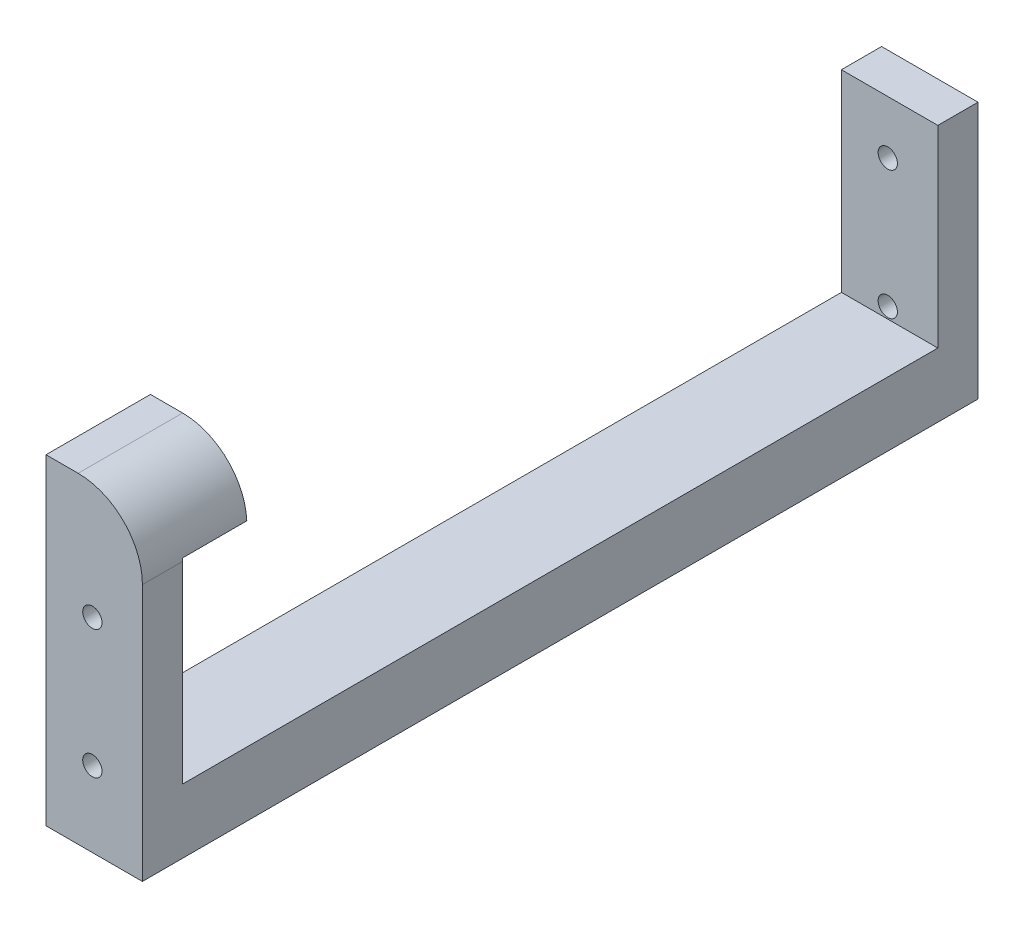
ISO-10303-21;
HEADER;
FILE_DESCRIPTION(('STEP AP214'),'2;1');
FILE_NAME('part.step','',(''),(''),'','','');
FILE_SCHEMA(('AUTOMOTIVE_DESIGN { 1 0 10303 214 1 1 1 1 }'));
ENDSEC;
DATA;
#1=APPLICATION_CONTEXT('core data for automotive mechanical design processes');
#2=APPLICATION_PROTOCOL_DEFINITION('international standard','automotive_design',2000,#1);
#3=PRODUCT_CONTEXT('',#1,'mechanical');
#4=PRODUCT('Part','Part','',(#3));
#5=PRODUCT_RELATED_PRODUCT_CATEGORY('part','',(#4));
#6=PRODUCT_DEFINITION_FORMATION('','',#4);
#7=PRODUCT_DEFINITION_CONTEXT('part definition',#1,'design');
#8=PRODUCT_DEFINITION('design','',#6,#7);
#9=PRODUCT_DEFINITION_SHAPE('','',#8);
#10=(LENGTH_UNIT() NAMED_UNIT(*) SI_UNIT(.MILLI.,.METRE.));
#11=(NAMED_UNIT(*) PLANE_ANGLE_UNIT() SI_UNIT($,.RADIAN.));
#12=(NAMED_UNIT(*) SI_UNIT($,.STERADIAN.) SOLID_ANGLE_UNIT());
#13=UNCERTAINTY_MEASURE_WITH_UNIT(LENGTH_MEASURE(1.E-05),#10,'distance_accuracy_value','');
#14=(GEOMETRIC_REPRESENTATION_CONTEXT(3) GLOBAL_UNCERTAINTY_ASSIGNED_CONTEXT((#13)) GLOBAL_UNIT_ASSIGNED_CONTEXT((#10,
#11,#12)) REPRESENTATION_CONTEXT('',''));
#15=CARTESIAN_POINT('',(0.,0.,0.));
#16=DIRECTION('',(0.,0.,1.));
#17=DIRECTION('',(1.,0.,0.));
#18=AXIS2_PLACEMENT_3D('',#15,#16,#17);
#19=CARTESIAN_POINT('',(-7.5,25.,130.));
#20=DIRECTION('',(1.,0.,0.));
#21=DIRECTION('',(0.,1.,0.));
#22=AXIS2_PLACEMENT_3D('',#19,#20,#21);
#23=PLANE('',#22);
#24=DIRECTION('',(0.,0.,1.));
#25=VECTOR('',#24,1.);
#26=CARTESIAN_POINT('',(-7.5,25.,0.));
#27=LINE('',#26,#25);
#28=CARTESIAN_POINT('',(-7.5,25.,0.));
#29=VERTEX_POINT('',#28);
#30=CARTESIAN_POINT('',(-7.5,25.,6.25000000000001));
#31=VERTEX_POINT('',#30);
#32=EDGE_CURVE('E122',#29,#31,#27,.T.);
#33=ORIENTED_EDGE('',*,*,#32,.F.);
#34=DIRECTION('',(0.,-1.,0.));
#35=VECTOR('',#34,1.);
#36=CARTESIAN_POINT('',(-7.5,25.,0.));
#37=LINE('',#36,#35);
#38=CARTESIAN_POINT('',(-7.5,-15.,0.));
#39=VERTEX_POINT('',#38);
#40=EDGE_CURVE('E143',#29,#39,#37,.T.);
#41=ORIENTED_EDGE('',*,*,#40,.T.);
#42=DIRECTION('',(0.,0.,-1.));
#43=VECTOR('',#42,1.);
#44=CARTESIAN_POINT('',(-7.5,-15.,130.));
#45=LINE('',#44,#43);
#46=CARTESIAN_POINT('',(-7.5,-15.,130.));
#47=VERTEX_POINT('',#46);
#48=EDGE_CURVE('E171',#47,#39,#45,.T.);
#49=ORIENTED_EDGE('',*,*,#48,.F.);
#50=DIRECTION('',(0.,-1.,0.));
#51=VECTOR('',#50,1.);
#52=CARTESIAN_POINT('',(-7.5,25.,130.));
#53=LINE('',#52,#51);
#54=CARTESIAN_POINT('',(-7.5,35.,130.));
#55=VERTEX_POINT('',#54);
#56=EDGE_CURVE('E157',#55,#47,#53,.T.);
#57=ORIENTED_EDGE('',*,*,#56,.F.);
#58=DIRECTION('',(0.,0.,1.));
#59=VECTOR('',#58,1.);
#60=CARTESIAN_POINT('',(-7.5,35.,123.75));
#61=LINE('',#60,#59);
#62=CARTESIAN_POINT('',(-7.5,35.,113.75));
#63=VERTEX_POINT('',#62);
#64=EDGE_CURVE('E218',#63,#55,#61,.T.);
#65=ORIENTED_EDGE('',*,*,#64,.F.);
#66=DIRECTION('',(0.,1.,0.));
#67=VECTOR('',#66,1.);
#68=CARTESIAN_POINT('',(-7.5,35.,113.75));
#69=LINE('',#68,#67);
#70=CARTESIAN_POINT('',(-7.5,25.4597920304156,113.75));
#71=VERTEX_POINT('',#70);
#72=EDGE_CURVE('E206',#71,#63,#69,.T.);
#73=ORIENTED_EDGE('',*,*,#72,.F.);
#74=DIRECTION('',(0.,0.,1.));
#75=VECTOR('',#74,1.);
#76=CARTESIAN_POINT('',(-7.5,25.4597920304156,113.75));
#77=LINE('',#76,#75);
#78=CARTESIAN_POINT('',(-7.5,25.4597920304156,123.75));
#79=VERTEX_POINT('',#78);
#80=EDGE_CURVE('E211',#71,#79,#77,.T.);
#81=ORIENTED_EDGE('',*,*,#80,.T.);
#82=DIRECTION('',(0.,1.,0.));
#83=VECTOR('',#82,1.);
#84=CARTESIAN_POINT('',(-7.49999999999999,-5.,123.75));
#85=LINE('',#84,#83);
#86=CARTESIAN_POINT('',(-7.49999999999999,-5.,123.75));
#87=VERTEX_POINT('',#86);
#88=EDGE_CURVE('E154',#87,#79,#85,.T.);
#89=ORIENTED_EDGE('',*,*,#88,.F.);
#90=DIRECTION('',(0.,0.,1.));
#91=VECTOR('',#90,1.);
#92=CARTESIAN_POINT('',(-7.5,-5.,6.25000000000001));
#93=LINE('',#92,#91);
#94=CARTESIAN_POINT('',(-7.5,-5.,6.25000000000001));
#95=VERTEX_POINT('',#94);
#96=EDGE_CURVE('E142',#95,#87,#93,.T.);
#97=ORIENTED_EDGE('',*,*,#96,.F.);
#98=DIRECTION('',(0.,1.,0.));
#99=VECTOR('',#98,1.);
#100=CARTESIAN_POINT('',(-7.5,-5.,6.25000000000001));
#101=LINE('',#100,#99);
#102=EDGE_CURVE('E134',#95,#31,#101,.T.);
#103=ORIENTED_EDGE('',*,*,#102,.T.);
#104=EDGE_LOOP('',(#33,#41,#49,#57,#65,#73,#81,#89,#97,#103));
#105=FACE_BOUND('',#104,.T.);
#106=ADVANCED_FACE('F41',(#105),#23,.F.);
#107=CARTESIAN_POINT('',(0.,0.,0.));
#108=DIRECTION('',(0.,0.,1.));
#109=DIRECTION('',(1.,0.,0.));
#110=AXIS2_PLACEMENT_3D('',#107,#108,#109);
#111=PLANE('',#110);
#112=CARTESIAN_POINT('',(-0.289357029762211,-3.28341129886374,0.));
#113=DIRECTION('',(0.,0.,1.));
#114=DIRECTION('',(1.,0.,0.));
#115=AXIS2_PLACEMENT_3D('',#112,#113,#114);
#116=CIRCLE('',#115,1.5);
#117=CARTESIAN_POINT('',(1.21064297023779,-3.28341129886374,0.));
#118=VERTEX_POINT('',#117);
#119=EDGE_CURVE('E184',#118,#118,#116,.T.);
#120=ORIENTED_EDGE('',*,*,#119,.T.);
#121=EDGE_LOOP('',(#120));
#122=FACE_BOUND('',#121,.T.);
#123=CARTESIAN_POINT('',(-0.289357029762211,16.7165887011363,0.));
#124=DIRECTION('',(0.,0.,1.));
#125=DIRECTION('',(1.,0.,0.));
#126=AXIS2_PLACEMENT_3D('',#123,#124,#125);
#127=CIRCLE('',#126,1.49999999999999);
#128=CARTESIAN_POINT('',(1.21064297023778,16.7165887011363,0.));
#129=VERTEX_POINT('',#128);
#130=EDGE_CURVE('E232',#129,#129,#127,.T.);
#131=ORIENTED_EDGE('',*,*,#130,.T.);
#132=EDGE_LOOP('',(#131));
#133=FACE_BOUND('',#132,.T.);
#134=DIRECTION('',(-1.,0.,0.));
#135=VECTOR('',#134,1.);
#136=CARTESIAN_POINT('',(-7.5,25.,0.));
#137=LINE('',#136,#135);
#138=CARTESIAN_POINT('',(7.5,25.,0.));
#139=VERTEX_POINT('',#138);
#140=EDGE_CURVE('E125',#139,#29,#137,.T.);
#141=ORIENTED_EDGE('',*,*,#140,.F.);
#142=DIRECTION('',(0.,1.,0.));
#143=VECTOR('',#142,1.);
#144=CARTESIAN_POINT('',(7.5,25.,0.));
#145=LINE('',#144,#143);
#146=CARTESIAN_POINT('',(7.5,-15.,0.));
#147=VERTEX_POINT('',#146);
#148=EDGE_CURVE('E161',#147,#139,#145,.T.);
#149=ORIENTED_EDGE('',*,*,#148,.F.);
#150=DIRECTION('',(1.,0.,0.));
#151=VECTOR('',#150,1.);
#152=CARTESIAN_POINT('',(-7.5,-15.,0.));
#153=LINE('',#152,#151);
#154=EDGE_CURVE('E145',#39,#147,#153,.T.);
#155=ORIENTED_EDGE('',*,*,#154,.F.);
#156=ORIENTED_EDGE('',*,*,#40,.F.);
#157=EDGE_LOOP('',(#141,#149,#155,#156));
#158=FACE_BOUND('',#157,.T.);
#159=ADVANCED_FACE('F198',(#122,#133,#158),#111,.F.);
#160=CARTESIAN_POINT('',(-7.5,-5.,6.25000000000001));
#161=DIRECTION('',(0.,0.,-1.));
#162=DIRECTION('',(-1.,0.,0.));
#163=AXIS2_PLACEMENT_3D('',#160,#161,#162);
#164=PLANE('',#163);
#165=CARTESIAN_POINT('',(-0.289357029762211,-3.28341129886374,6.25000000000001));
#166=DIRECTION('',(0.,0.,-1.));
#167=DIRECTION('',(-1.,0.,0.));
#168=AXIS2_PLACEMENT_3D('',#165,#166,#167);
#169=CIRCLE('',#168,1.5);
#170=CARTESIAN_POINT('',(-1.78935702976221,-3.28341129886374,6.25000000000001));
#171=VERTEX_POINT('',#170);
#172=EDGE_CURVE('E178',#171,#171,#169,.T.);
#173=ORIENTED_EDGE('',*,*,#172,.T.);
#174=EDGE_LOOP('',(#173));
#175=FACE_BOUND('',#174,.T.);
#176=CARTESIAN_POINT('',(-0.289357029762211,16.7165887011363,6.25000000000001));
#177=DIRECTION('',(0.,0.,-1.));
#178=DIRECTION('',(-1.,0.,0.));
#179=AXIS2_PLACEMENT_3D('',#176,#177,#178);
#180=CIRCLE('',#179,1.49999999999999);
#181=CARTESIAN_POINT('',(-1.7893570297622,16.7165887011363,6.25000000000001));
#182=VERTEX_POINT('',#181);
#183=EDGE_CURVE('E183',#182,#182,#180,.T.);
#184=ORIENTED_EDGE('',*,*,#183,.T.);
#185=EDGE_LOOP('',(#184));
#186=FACE_BOUND('',#185,.T.);
#187=DIRECTION('',(1.,0.,0.));
#188=VECTOR('',#187,1.);
#189=CARTESIAN_POINT('',(-7.5,25.,6.25000000000001));
#190=LINE('',#189,#188);
#191=CARTESIAN_POINT('',(7.5,25.,6.25000000000001));
#192=VERTEX_POINT('',#191);
#193=EDGE_CURVE('E63',#31,#192,#190,.T.);
#194=ORIENTED_EDGE('',*,*,#193,.F.);
#195=ORIENTED_EDGE('',*,*,#102,.F.);
#196=DIRECTION('',(-1.,0.,0.));
#197=VECTOR('',#196,1.);
#198=CARTESIAN_POINT('',(-7.5,-5.,6.25000000000001));
#199=LINE('',#198,#197);
#200=CARTESIAN_POINT('',(7.5,-5.,6.25000000000001));
#201=VERTEX_POINT('',#200);
#202=EDGE_CURVE('E150',#201,#95,#199,.T.);
#203=ORIENTED_EDGE('',*,*,#202,.F.);
#204=DIRECTION('',(0.,1.,0.));
#205=VECTOR('',#204,1.);
#206=CARTESIAN_POINT('',(7.5,-5.,6.25000000000001));
#207=LINE('',#206,#205);
#208=EDGE_CURVE('E137',#201,#192,#207,.T.);
#209=ORIENTED_EDGE('',*,*,#208,.T.);
#210=EDGE_LOOP('',(#194,#195,#203,#209));
#211=FACE_BOUND('',#210,.T.);
#212=ADVANCED_FACE('F132',(#175,#186,#211),#164,.F.);
#213=CARTESIAN_POINT('',(-7.49999999999999,-5.,123.75));
#214=DIRECTION('',(0.,0.,1.));
#215=DIRECTION('',(1.,0.,0.));
#216=AXIS2_PLACEMENT_3D('',#213,#214,#215);
#217=PLANE('',#216);
#218=CARTESIAN_POINT('',(-0.289357029762211,-3.28341129886374,123.75));
#219=DIRECTION('',(0.,0.,1.));
#220=DIRECTION('',(1.,0.,0.));
#221=AXIS2_PLACEMENT_3D('',#218,#219,#220);
#222=CIRCLE('',#221,1.5);
#223=CARTESIAN_POINT('',(1.21064297023779,-3.28341129886374,123.75));
#224=VERTEX_POINT('',#223);
#225=EDGE_CURVE('E175',#224,#224,#222,.T.);
#226=ORIENTED_EDGE('',*,*,#225,.T.);
#227=EDGE_LOOP('',(#226));
#228=FACE_BOUND('',#227,.T.);
#229=CARTESIAN_POINT('',(-0.289357029762211,16.7165887011363,123.75));
#230=DIRECTION('',(0.,0.,1.));
#231=DIRECTION('',(1.,0.,0.));
#232=AXIS2_PLACEMENT_3D('',#229,#230,#231);
#233=CIRCLE('',#232,1.49999999999999);
#234=CARTESIAN_POINT('',(1.21064297023778,16.7165887011363,123.75));
#235=VERTEX_POINT('',#234);
#236=EDGE_CURVE('E180',#235,#235,#233,.T.);
#237=ORIENTED_EDGE('',*,*,#236,.T.);
#238=EDGE_LOOP('',(#237));
#239=FACE_BOUND('',#238,.T.);
#240=DIRECTION('',(-1.,0.,0.));
#241=VECTOR('',#240,1.);
#242=CARTESIAN_POINT('',(7.5,25.4597920304156,123.75));
#243=LINE('',#242,#241);
#244=CARTESIAN_POINT('',(7.48942397181971,25.4597920304156,123.75));
#245=VERTEX_POINT('',#244);
#246=EDGE_CURVE('E200',#245,#79,#243,.T.);
#247=ORIENTED_EDGE('',*,*,#246,.F.);
#248=CARTESIAN_POINT('',(-2.5,25.,123.75));
#249=DIRECTION('',(0.,0.,1.));
#250=DIRECTION('',(1.,0.,0.));
#251=AXIS2_PLACEMENT_3D('',#248,#249,#250);
#252=CIRCLE('',#251,10.);
#253=CARTESIAN_POINT('',(7.5,25.,123.75));
#254=VERTEX_POINT('',#253);
#255=EDGE_CURVE('E191',#245,#254,#252,.F.);
#256=ORIENTED_EDGE('',*,*,#255,.T.);
#257=DIRECTION('',(0.,1.,0.));
#258=VECTOR('',#257,1.);
#259=CARTESIAN_POINT('',(7.5,-5.,123.75));
#260=LINE('',#259,#258);
#261=CARTESIAN_POINT('',(7.5,-5.,123.75));
#262=VERTEX_POINT('',#261);
#263=EDGE_CURVE('E147',#262,#254,#260,.T.);
#264=ORIENTED_EDGE('',*,*,#263,.F.);
#265=DIRECTION('',(1.,0.,0.));
#266=VECTOR('',#265,1.);
#267=CARTESIAN_POINT('',(-7.49999999999999,-5.,123.75));
#268=LINE('',#267,#266);
#269=EDGE_CURVE('E236',#87,#262,#268,.T.);
#270=ORIENTED_EDGE('',*,*,#269,.F.);
#271=ORIENTED_EDGE('',*,*,#88,.T.);
#272=EDGE_LOOP('',(#247,#256,#264,#270,#271));
#273=FACE_BOUND('',#272,.T.);
#274=ADVANCED_FACE('F245',(#228,#239,#273),#217,.F.);
#275=CARTESIAN_POINT('',(-7.5,-15.,130.));
#276=DIRECTION('',(0.,1.,0.));
#277=DIRECTION('',(0.,0.,1.));
#278=AXIS2_PLACEMENT_3D('',#275,#276,#277);
#279=PLANE('',#278);
#280=ORIENTED_EDGE('',*,*,#154,.T.);
#281=DIRECTION('',(0.,0.,-1.));
#282=VECTOR('',#281,1.);
#283=CARTESIAN_POINT('',(7.5,-15.,130.));
#284=LINE('',#283,#282);
#285=CARTESIAN_POINT('',(7.5,-15.,130.));
#286=VERTEX_POINT('',#285);
#287=EDGE_CURVE('E164',#286,#147,#284,.T.);
#288=ORIENTED_EDGE('',*,*,#287,.F.);
#289=DIRECTION('',(1.,0.,0.));
#290=VECTOR('',#289,1.);
#291=CARTESIAN_POINT('',(-7.5,-15.,130.));
#292=LINE('',#291,#290);
#293=EDGE_CURVE('E160',#47,#286,#292,.T.);
#294=ORIENTED_EDGE('',*,*,#293,.F.);
#295=ORIENTED_EDGE('',*,*,#48,.T.);
#296=EDGE_LOOP('',(#280,#288,#294,#295));
#297=FACE_BOUND('',#296,.T.);
#298=ADVANCED_FACE('F280',(#297),#279,.F.);
#299=CARTESIAN_POINT('',(7.5,25.,130.));
#300=DIRECTION('',(-1.,0.,0.));
#301=DIRECTION('',(0.,-1.,0.));
#302=AXIS2_PLACEMENT_3D('',#299,#300,#301);
#303=PLANE('',#302);
#304=ORIENTED_EDGE('',*,*,#263,.T.);
#305=DIRECTION('',(0.,0.,-1.));
#306=VECTOR('',#305,1.);
#307=CARTESIAN_POINT('',(7.5,25.,130.));
#308=LINE('',#307,#306);
#309=CARTESIAN_POINT('',(7.5,25.,130.));
#310=VERTEX_POINT('',#309);
#311=EDGE_CURVE('E49',#254,#310,#308,.F.);
#312=ORIENTED_EDGE('',*,*,#311,.T.);
#313=DIRECTION('',(0.,1.,0.));
#314=VECTOR('',#313,1.);
#315=CARTESIAN_POINT('',(7.5,25.,130.));
#316=LINE('',#315,#314);
#317=EDGE_CURVE('E163',#286,#310,#316,.T.);
#318=ORIENTED_EDGE('',*,*,#317,.F.);
#319=ORIENTED_EDGE('',*,*,#287,.T.);
#320=ORIENTED_EDGE('',*,*,#148,.T.);
#321=DIRECTION('',(0.,0.,-1.));
#322=VECTOR('',#321,1.);
#323=CARTESIAN_POINT('',(7.5,25.,6.25000000000001));
#324=LINE('',#323,#322);
#325=EDGE_CURVE('E193',#139,#192,#324,.F.);
#326=ORIENTED_EDGE('',*,*,#325,.T.);
#327=ORIENTED_EDGE('',*,*,#208,.F.);
#328=DIRECTION('',(0.,0.,-1.));
#329=VECTOR('',#328,1.);
#330=CARTESIAN_POINT('',(7.5,-5.,6.25000000000001));
#331=LINE('',#330,#329);
#332=EDGE_CURVE('E238',#262,#201,#331,.T.);
#333=ORIENTED_EDGE('',*,*,#332,.F.);
#334=EDGE_LOOP('',(#304,#312,#318,#319,#320,#326,#327,#333));
#335=FACE_BOUND('',#334,.T.);
#336=ADVANCED_FACE('F194',(#335),#303,.F.);
#337=CARTESIAN_POINT('',(0.,0.,130.));
#338=DIRECTION('',(0.,0.,1.));
#339=DIRECTION('',(1.,0.,0.));
#340=AXIS2_PLACEMENT_3D('',#337,#338,#339);
#341=PLANE('',#340);
#342=CARTESIAN_POINT('',(-0.289357029762211,16.7165887011363,130.));
#343=DIRECTION('',(0.,0.,-1.));
#344=DIRECTION('',(-1.,0.,0.));
#345=AXIS2_PLACEMENT_3D('',#342,#343,#344);
#346=CIRCLE('',#345,1.49999999999999);
#347=CARTESIAN_POINT('',(-1.7893570297622,16.7165887011363,130.));
#348=VERTEX_POINT('',#347);
#349=EDGE_CURVE('E179',#348,#348,#346,.T.);
#350=ORIENTED_EDGE('',*,*,#349,.T.);
#351=EDGE_LOOP('',(#350));
#352=FACE_BOUND('',#351,.T.);
#353=CARTESIAN_POINT('',(-0.289357029762211,-3.28341129886374,130.));
#354=DIRECTION('',(0.,0.,-1.));
#355=DIRECTION('',(-1.,0.,0.));
#356=AXIS2_PLACEMENT_3D('',#353,#354,#355);
#357=CIRCLE('',#356,1.5);
#358=CARTESIAN_POINT('',(-1.78935702976221,-3.28341129886374,130.));
#359=VERTEX_POINT('',#358);
#360=EDGE_CURVE('E221',#359,#359,#357,.T.);
#361=ORIENTED_EDGE('',*,*,#360,.T.);
#362=EDGE_LOOP('',(#361));
#363=FACE_BOUND('',#362,.T.);
#364=ORIENTED_EDGE('',*,*,#317,.T.);
#365=CARTESIAN_POINT('',(-2.5,25.,130.));
#366=DIRECTION('',(0.,0.,1.));
#367=DIRECTION('',(1.,0.,0.));
#368=AXIS2_PLACEMENT_3D('',#365,#366,#367);
#369=CIRCLE('',#368,10.);
#370=CARTESIAN_POINT('',(-2.5,35.,130.));
#371=VERTEX_POINT('',#370);
#372=EDGE_CURVE('E11',#310,#371,#369,.T.);
#373=ORIENTED_EDGE('',*,*,#372,.T.);
#374=DIRECTION('',(1.,0.,0.));
#375=VECTOR('',#374,1.);
#376=CARTESIAN_POINT('',(-7.5,35.,130.));
#377=LINE('',#376,#375);
#378=EDGE_CURVE('E215',#55,#371,#377,.T.);
#379=ORIENTED_EDGE('',*,*,#378,.F.);
#380=ORIENTED_EDGE('',*,*,#56,.T.);
#381=ORIENTED_EDGE('',*,*,#293,.T.);
#382=EDGE_LOOP('',(#364,#373,#379,#380,#381));
#383=FACE_BOUND('',#382,.T.);
#384=ADVANCED_FACE('F253',(#352,#363,#383),#341,.T.);
#385=CARTESIAN_POINT('',(0.,-5.,0.));
#386=DIRECTION('',(0.,1.,0.));
#387=DIRECTION('',(0.,0.,1.));
#388=AXIS2_PLACEMENT_3D('',#385,#386,#387);
#389=PLANE('',#388);
#390=ORIENTED_EDGE('',*,*,#96,.T.);
#391=ORIENTED_EDGE('',*,*,#269,.T.);
#392=ORIENTED_EDGE('',*,*,#332,.T.);
#393=ORIENTED_EDGE('',*,*,#202,.T.);
#394=EDGE_LOOP('',(#390,#391,#392,#393));
#395=FACE_BOUND('',#394,.T.);
#396=ADVANCED_FACE('F240',(#395),#389,.T.);
#397=CARTESIAN_POINT('',(-0.289357029762211,-3.28341129886374,130.));
#398=DIRECTION('',(0.,0.,-1.));
#399=DIRECTION('',(-1.,0.,0.));
#400=AXIS2_PLACEMENT_3D('',#397,#398,#399);
#401=CYLINDRICAL_SURFACE('',#400,1.5);
#402=ORIENTED_EDGE('',*,*,#360,.F.);
#403=EDGE_LOOP('',(#402));
#404=FACE_BOUND('',#403,.T.);
#405=ORIENTED_EDGE('',*,*,#225,.F.);
#406=EDGE_LOOP('',(#405));
#407=FACE_BOUND('',#406,.T.);
#408=ADVANCED_FACE('F297',(#404,#407),#401,.F.);
#409=CARTESIAN_POINT('',(-0.289357029762211,16.7165887011363,130.));
#410=DIRECTION('',(0.,0.,-1.));
#411=DIRECTION('',(-1.,0.,0.));
#412=AXIS2_PLACEMENT_3D('',#409,#410,#411);
#413=CYLINDRICAL_SURFACE('',#412,1.49999999999999);
#414=ORIENTED_EDGE('',*,*,#349,.F.);
#415=EDGE_LOOP('',(#414));
#416=FACE_BOUND('',#415,.T.);
#417=ORIENTED_EDGE('',*,*,#236,.F.);
#418=EDGE_LOOP('',(#417));
#419=FACE_BOUND('',#418,.T.);
#420=ADVANCED_FACE('F301',(#416,#419),#413,.F.);
#421=ORIENTED_EDGE('',*,*,#172,.F.);
#422=EDGE_LOOP('',(#421));
#423=FACE_BOUND('',#422,.T.);
#424=ORIENTED_EDGE('',*,*,#119,.F.);
#425=EDGE_LOOP('',(#424));
#426=FACE_BOUND('',#425,.T.);
#427=ADVANCED_FACE('F298',(#423,#426),#401,.F.);
#428=ORIENTED_EDGE('',*,*,#183,.F.);
#429=EDGE_LOOP('',(#428));
#430=FACE_BOUND('',#429,.T.);
#431=ORIENTED_EDGE('',*,*,#130,.F.);
#432=EDGE_LOOP('',(#431));
#433=FACE_BOUND('',#432,.T.);
#434=ADVANCED_FACE('F270',(#430,#433),#413,.F.);
#435=CARTESIAN_POINT('',(0.,35.,0.));
#436=DIRECTION('',(0.,1.,0.));
#437=DIRECTION('',(0.,0.,1.));
#438=AXIS2_PLACEMENT_3D('',#435,#436,#437);
#439=PLANE('',#438);
#440=ORIENTED_EDGE('',*,*,#378,.T.);
#441=DIRECTION('',(0.,0.,-1.));
#442=VECTOR('',#441,1.);
#443=CARTESIAN_POINT('',(-2.5,35.,113.75));
#444=LINE('',#443,#442);
#445=CARTESIAN_POINT('',(-2.5,35.,113.75));
#446=VERTEX_POINT('',#445);
#447=EDGE_CURVE('E174',#371,#446,#444,.T.);
#448=ORIENTED_EDGE('',*,*,#447,.T.);
#449=DIRECTION('',(1.,0.,0.));
#450=VECTOR('',#449,1.);
#451=CARTESIAN_POINT('',(7.5,35.,113.75));
#452=LINE('',#451,#450);
#453=EDGE_CURVE('E209',#63,#446,#452,.T.);
#454=ORIENTED_EDGE('',*,*,#453,.F.);
#455=ORIENTED_EDGE('',*,*,#64,.T.);
#456=EDGE_LOOP('',(#440,#448,#454,#455));
#457=FACE_BOUND('',#456,.T.);
#458=ADVANCED_FACE('F255',(#457),#439,.T.);
#459=CARTESIAN_POINT('',(7.5,25.4597920304156,113.75));
#460=DIRECTION('',(0.,1.,0.));
#461=DIRECTION('',(0.,0.,1.));
#462=AXIS2_PLACEMENT_3D('',#459,#460,#461);
#463=PLANE('',#462);
#464=DIRECTION('',(-1.,0.,0.));
#465=VECTOR('',#464,1.);
#466=CARTESIAN_POINT('',(7.5,25.4597920304156,113.75));
#467=LINE('',#466,#465);
#468=CARTESIAN_POINT('',(7.48942397181971,25.4597920304156,113.75));
#469=VERTEX_POINT('',#468);
#470=EDGE_CURVE('E202',#469,#71,#467,.T.);
#471=ORIENTED_EDGE('',*,*,#470,.F.);
#472=DIRECTION('',(0.,0.,1.));
#473=VECTOR('',#472,1.);
#474=CARTESIAN_POINT('',(7.48942397181971,25.4597920304156,113.75));
#475=LINE('',#474,#473);
#476=EDGE_CURVE('E189',#469,#245,#475,.T.);
#477=ORIENTED_EDGE('',*,*,#476,.T.);
#478=ORIENTED_EDGE('',*,*,#246,.T.);
#479=ORIENTED_EDGE('',*,*,#80,.F.);
#480=EDGE_LOOP('',(#471,#477,#478,#479));
#481=FACE_BOUND('',#480,.T.);
#482=ADVANCED_FACE('F262',(#481),#463,.F.);
#483=CARTESIAN_POINT('',(0.,0.,113.75));
#484=DIRECTION('',(0.,0.,-1.));
#485=DIRECTION('',(-1.,0.,0.));
#486=AXIS2_PLACEMENT_3D('',#483,#484,#485);
#487=PLANE('',#486);
#488=ORIENTED_EDGE('',*,*,#453,.T.);
#489=CARTESIAN_POINT('',(-2.5,25.,113.75));
#490=DIRECTION('',(0.,0.,-1.));
#491=DIRECTION('',(-1.,0.,0.));
#492=AXIS2_PLACEMENT_3D('',#489,#490,#491);
#493=CIRCLE('',#492,10.);
#494=EDGE_CURVE('E187',#446,#469,#493,.T.);
#495=ORIENTED_EDGE('',*,*,#494,.T.);
#496=ORIENTED_EDGE('',*,*,#470,.T.);
#497=ORIENTED_EDGE('',*,*,#72,.T.);
#498=EDGE_LOOP('',(#488,#495,#496,#497));
#499=FACE_BOUND('',#498,.T.);
#500=ADVANCED_FACE('F259',(#499),#487,.T.);
#501=CARTESIAN_POINT('',(-2.5,25.,0.));
#502=DIRECTION('',(0.,0.,1.));
#503=DIRECTION('',(1.,0.,0.));
#504=AXIS2_PLACEMENT_3D('',#501,#502,#503);
#505=CYLINDRICAL_SURFACE('',#504,10.);
#506=ORIENTED_EDGE('',*,*,#372,.F.);
#507=ORIENTED_EDGE('',*,*,#311,.F.);
#508=ORIENTED_EDGE('',*,*,#255,.F.);
#509=ORIENTED_EDGE('',*,*,#476,.F.);
#510=ORIENTED_EDGE('',*,*,#494,.F.);
#511=ORIENTED_EDGE('',*,*,#447,.F.);
#512=EDGE_LOOP('',(#506,#507,#508,#509,#510,#511));
#513=FACE_BOUND('',#512,.T.);
#514=ADVANCED_FACE('F43',(#513),#505,.T.);
#515=CARTESIAN_POINT('',(0.,25.,0.));
#516=DIRECTION('',(0.,1.,0.));
#517=DIRECTION('',(0.,0.,1.));
#518=AXIS2_PLACEMENT_3D('',#515,#516,#517);
#519=PLANE('',#518);
#520=ORIENTED_EDGE('',*,*,#32,.T.);
#521=ORIENTED_EDGE('',*,*,#193,.T.);
#522=ORIENTED_EDGE('',*,*,#325,.F.);
#523=ORIENTED_EDGE('',*,*,#140,.T.);
#524=EDGE_LOOP('',(#520,#521,#522,#523));
#525=FACE_BOUND('',#524,.T.);
#526=ADVANCED_FACE('F123',(#525),#519,.T.);
#527=CLOSED_SHELL('',(#106,#159,#212,#274,#298,#336,#384,#396,#408,#420,#427,#434,#458,#482,
#500,#514,#526));
#528=MANIFOLD_SOLID_BREP('B2',#527);
#529=ADVANCED_BREP_SHAPE_REPRESENTATION('',(#18,#528),#14);
#530=SHAPE_DEFINITION_REPRESENTATION(#9,#529);
ENDSEC;
END-ISO-10303-21;
